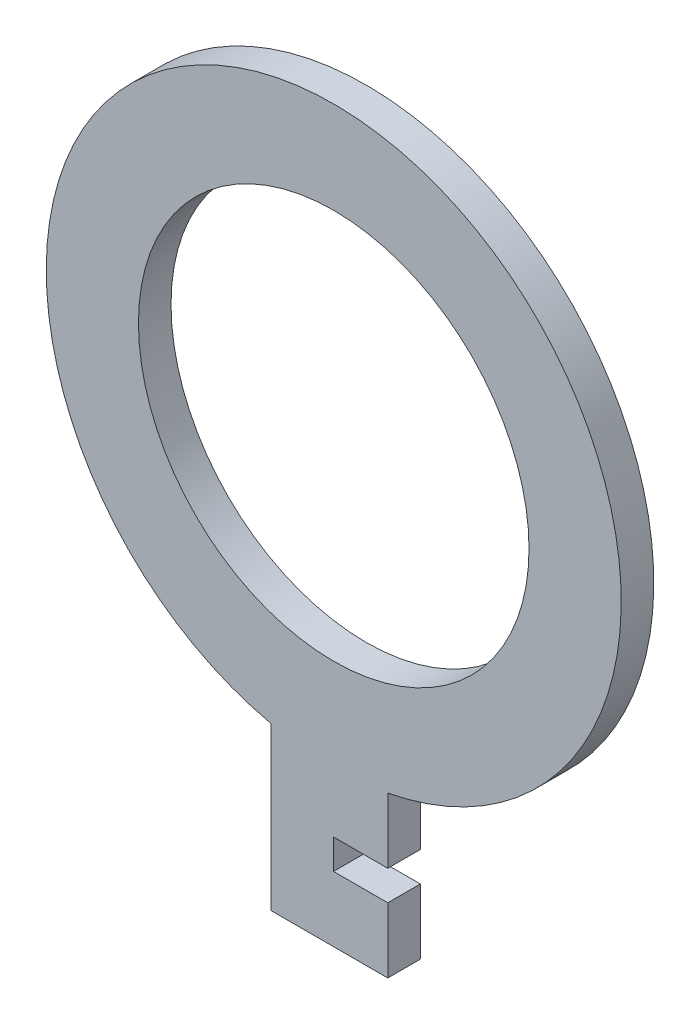
ISO-10303-21;
HEADER;
FILE_DESCRIPTION(('STEP AP214'),'2;1');
FILE_NAME('part.step','',(''),(''),'','','');
FILE_SCHEMA(('AUTOMOTIVE_DESIGN { 1 0 10303 214 1 1 1 1 }'));
ENDSEC;
DATA;
#1=APPLICATION_CONTEXT('core data for automotive mechanical design processes');
#2=APPLICATION_PROTOCOL_DEFINITION('international standard','automotive_design',2000,#1);
#3=PRODUCT_CONTEXT('',#1,'mechanical');
#4=PRODUCT('Part','Part','',(#3));
#5=PRODUCT_RELATED_PRODUCT_CATEGORY('part','',(#4));
#6=PRODUCT_DEFINITION_FORMATION('','',#4);
#7=PRODUCT_DEFINITION_CONTEXT('part definition',#1,'design');
#8=PRODUCT_DEFINITION('design','',#6,#7);
#9=PRODUCT_DEFINITION_SHAPE('','',#8);
#10=(LENGTH_UNIT() NAMED_UNIT(*) SI_UNIT(.MILLI.,.METRE.));
#11=(NAMED_UNIT(*) PLANE_ANGLE_UNIT() SI_UNIT($,.RADIAN.));
#12=(NAMED_UNIT(*) SI_UNIT($,.STERADIAN.) SOLID_ANGLE_UNIT());
#13=UNCERTAINTY_MEASURE_WITH_UNIT(LENGTH_MEASURE(1.E-05),#10,'distance_accuracy_value','');
#14=(GEOMETRIC_REPRESENTATION_CONTEXT(3) GLOBAL_UNCERTAINTY_ASSIGNED_CONTEXT((#13)) GLOBAL_UNIT_ASSIGNED_CONTEXT((#10,
#11,#12)) REPRESENTATION_CONTEXT('',''));
#15=CARTESIAN_POINT('',(0.,0.,0.));
#16=DIRECTION('',(0.,0.,1.));
#17=DIRECTION('',(1.,0.,0.));
#18=AXIS2_PLACEMENT_3D('',#15,#16,#17);
#19=CARTESIAN_POINT('',(69.9384446748844,-1.61765149134436E-13,3.));
#20=DIRECTION('',(-1.,0.,0.));
#21=DIRECTION('',(0.,-1.,0.));
#22=AXIS2_PLACEMENT_3D('',#19,#20,#21);
#23=PLANE('',#22);
#24=DIRECTION('',(0.,1.,0.));
#25=VECTOR('',#24,1.);
#26=CARTESIAN_POINT('',(69.9384446748844,-1.61765149134436E-13,0.));
#27=LINE('',#26,#25);
#28=CARTESIAN_POINT('',(69.9384446748844,26.4211799837218,0.));
#29=VERTEX_POINT('',#28);
#30=CARTESIAN_POINT('',(69.9384446748844,32.4211799837217,0.));
#31=VERTEX_POINT('',#30);
#32=EDGE_CURVE('E153',#29,#31,#27,.T.);
#33=ORIENTED_EDGE('',*,*,#32,.T.);
#34=DIRECTION('',(0.,0.,-1.));
#35=VECTOR('',#34,1.);
#36=CARTESIAN_POINT('',(69.9384446748844,32.4211799837217,3.));
#37=LINE('',#36,#35);
#38=CARTESIAN_POINT('',(69.9384446748844,32.4211799837217,3.));
#39=VERTEX_POINT('',#38);
#40=EDGE_CURVE('E11',#39,#31,#37,.T.);
#41=ORIENTED_EDGE('',*,*,#40,.F.);
#42=DIRECTION('',(0.,1.,0.));
#43=VECTOR('',#42,1.);
#44=CARTESIAN_POINT('',(69.9384446748844,-1.61765149134436E-13,3.));
#45=LINE('',#44,#43);
#46=CARTESIAN_POINT('',(69.9384446748844,26.4211799837218,3.));
#47=VERTEX_POINT('',#46);
#48=EDGE_CURVE('E214',#47,#39,#45,.T.);
#49=ORIENTED_EDGE('',*,*,#48,.F.);
#50=DIRECTION('',(0.,0.,-1.));
#51=VECTOR('',#50,1.);
#52=CARTESIAN_POINT('',(69.9384446748844,26.4211799837218,3.));
#53=LINE('',#52,#51);
#54=EDGE_CURVE('E63',#47,#29,#53,.T.);
#55=ORIENTED_EDGE('',*,*,#54,.T.);
#56=EDGE_LOOP('',(#33,#41,#49,#55));
#57=FACE_BOUND('',#56,.T.);
#58=ADVANCED_FACE('F45',(#57),#23,.F.);
#59=CARTESIAN_POINT('',(64.9620424457152,58.4262025645052,3.));
#60=DIRECTION('',(0.,0.,-1.));
#61=DIRECTION('',(-1.,0.,0.));
#62=AXIS2_PLACEMENT_3D('',#59,#60,#61);
#63=CYLINDRICAL_SURFACE('',#62,26.4768914069144);
#64=CARTESIAN_POINT('',(64.9620424457152,58.4262025645052,0.));
#65=DIRECTION('',(0.,0.,1.));
#66=DIRECTION('',(1.,0.,0.));
#67=AXIS2_PLACEMENT_3D('',#64,#65,#66);
#68=CIRCLE('',#67,26.4768914069144);
#69=CARTESIAN_POINT('',(59.1984010618232,32.5842557227631,0.));
#70=VERTEX_POINT('',#69);
#71=EDGE_CURVE('E156',#31,#70,#68,.T.);
#72=ORIENTED_EDGE('',*,*,#71,.T.);
#73=DIRECTION('',(0.,0.,-1.));
#74=VECTOR('',#73,1.);
#75=CARTESIAN_POINT('',(59.1984010618232,32.5842557227631,3.));
#76=LINE('',#75,#74);
#77=CARTESIAN_POINT('',(59.1984010618232,32.5842557227631,3.));
#78=VERTEX_POINT('',#77);
#79=EDGE_CURVE('E55',#78,#70,#76,.T.);
#80=ORIENTED_EDGE('',*,*,#79,.F.);
#81=CARTESIAN_POINT('',(64.9620424457152,58.4262025645052,3.));
#82=DIRECTION('',(0.,0.,1.));
#83=DIRECTION('',(1.,0.,0.));
#84=AXIS2_PLACEMENT_3D('',#81,#82,#83);
#85=CIRCLE('',#84,26.4768914069144);
#86=EDGE_CURVE('E101',#39,#78,#85,.T.);
#87=ORIENTED_EDGE('',*,*,#86,.F.);
#88=ORIENTED_EDGE('',*,*,#40,.T.);
#89=EDGE_LOOP('',(#72,#80,#87,#88));
#90=FACE_BOUND('',#89,.T.);
#91=ADVANCED_FACE('F199',(#90),#63,.T.);
#92=CARTESIAN_POINT('',(59.1984010618232,0.,3.));
#93=DIRECTION('',(-1.,0.,0.));
#94=DIRECTION('',(0.,-1.,0.));
#95=AXIS2_PLACEMENT_3D('',#92,#93,#94);
#96=PLANE('',#95);
#97=DIRECTION('',(0.,1.,0.));
#98=VECTOR('',#97,1.);
#99=CARTESIAN_POINT('',(59.1984010618232,0.,0.));
#100=LINE('',#99,#98);
#101=CARTESIAN_POINT('',(59.1984010618232,17.6711799837217,0.));
#102=VERTEX_POINT('',#101);
#103=EDGE_CURVE('E160',#102,#70,#100,.T.);
#104=ORIENTED_EDGE('',*,*,#103,.F.);
#105=DIRECTION('',(0.,0.,-1.));
#106=VECTOR('',#105,1.);
#107=CARTESIAN_POINT('',(59.1984010618232,17.6711799837217,3.));
#108=LINE('',#107,#106);
#109=CARTESIAN_POINT('',(59.1984010618232,17.6711799837217,3.));
#110=VERTEX_POINT('',#109);
#111=EDGE_CURVE('E190',#110,#102,#108,.T.);
#112=ORIENTED_EDGE('',*,*,#111,.F.);
#113=DIRECTION('',(0.,1.,0.));
#114=VECTOR('',#113,1.);
#115=CARTESIAN_POINT('',(59.1984010618232,0.,3.));
#116=LINE('',#115,#114);
#117=EDGE_CURVE('E198',#110,#78,#116,.T.);
#118=ORIENTED_EDGE('',*,*,#117,.T.);
#119=ORIENTED_EDGE('',*,*,#79,.T.);
#120=EDGE_LOOP('',(#104,#112,#118,#119));
#121=FACE_BOUND('',#120,.T.);
#122=ADVANCED_FACE('F196',(#121),#96,.T.);
#123=CARTESIAN_POINT('',(0.,17.6711799837217,3.));
#124=DIRECTION('',(0.,-1.,0.));
#125=DIRECTION('',(1.,0.,0.));
#126=AXIS2_PLACEMENT_3D('',#123,#124,#125);
#127=PLANE('',#126);
#128=DIRECTION('',(-1.,0.,0.));
#129=VECTOR('',#128,1.);
#130=CARTESIAN_POINT('',(0.,17.6711799837217,0.));
#131=LINE('',#130,#129);
#132=CARTESIAN_POINT('',(69.9384446748844,17.6711799837218,0.));
#133=VERTEX_POINT('',#132);
#134=EDGE_CURVE('E164',#133,#102,#131,.T.);
#135=ORIENTED_EDGE('',*,*,#134,.F.);
#136=DIRECTION('',(0.,0.,-1.));
#137=VECTOR('',#136,1.);
#138=CARTESIAN_POINT('',(69.9384446748844,17.6711799837218,3.));
#139=LINE('',#138,#137);
#140=CARTESIAN_POINT('',(69.9384446748844,17.6711799837218,3.));
#141=VERTEX_POINT('',#140);
#142=EDGE_CURVE('E187',#141,#133,#139,.T.);
#143=ORIENTED_EDGE('',*,*,#142,.F.);
#144=DIRECTION('',(-1.,0.,0.));
#145=VECTOR('',#144,1.);
#146=CARTESIAN_POINT('',(0.,17.6711799837217,3.));
#147=LINE('',#146,#145);
#148=EDGE_CURVE('E208',#141,#110,#147,.T.);
#149=ORIENTED_EDGE('',*,*,#148,.T.);
#150=ORIENTED_EDGE('',*,*,#111,.T.);
#151=EDGE_LOOP('',(#135,#143,#149,#150));
#152=FACE_BOUND('',#151,.T.);
#153=ADVANCED_FACE('F206',(#152),#127,.T.);
#154=CARTESIAN_POINT('',(69.9384446748844,-1.61765149134436E-13,3.));
#155=DIRECTION('',(-1.,0.,0.));
#156=DIRECTION('',(0.,-1.,0.));
#157=AXIS2_PLACEMENT_3D('',#154,#155,#156);
#158=PLANE('',#157);
#159=DIRECTION('',(0.,1.,0.));
#160=VECTOR('',#159,1.);
#161=CARTESIAN_POINT('',(69.9384446748844,-1.61765149134436E-13,0.));
#162=LINE('',#161,#160);
#163=CARTESIAN_POINT('',(69.9384446748844,23.6711799837218,0.));
#164=VERTEX_POINT('',#163);
#165=EDGE_CURVE('E168',#133,#164,#162,.T.);
#166=ORIENTED_EDGE('',*,*,#165,.T.);
#167=DIRECTION('',(0.,0.,-1.));
#168=VECTOR('',#167,1.);
#169=CARTESIAN_POINT('',(69.9384446748844,23.6711799837218,3.));
#170=LINE('',#169,#168);
#171=CARTESIAN_POINT('',(69.9384446748844,23.6711799837218,3.));
#172=VERTEX_POINT('',#171);
#173=EDGE_CURVE('E139',#172,#164,#170,.T.);
#174=ORIENTED_EDGE('',*,*,#173,.F.);
#175=DIRECTION('',(0.,1.,0.));
#176=VECTOR('',#175,1.);
#177=CARTESIAN_POINT('',(69.9384446748844,-1.61765149134436E-13,3.));
#178=LINE('',#177,#176);
#179=EDGE_CURVE('E125',#141,#172,#178,.T.);
#180=ORIENTED_EDGE('',*,*,#179,.F.);
#181=ORIENTED_EDGE('',*,*,#142,.T.);
#182=EDGE_LOOP('',(#166,#174,#180,#181));
#183=FACE_BOUND('',#182,.T.);
#184=ADVANCED_FACE('F246',(#183),#158,.F.);
#185=CARTESIAN_POINT('',(0.,23.6711799837218,3.));
#186=DIRECTION('',(0.,-1.,0.));
#187=DIRECTION('',(0.,0.,-1.));
#188=AXIS2_PLACEMENT_3D('',#185,#186,#187);
#189=PLANE('',#188);
#190=DIRECTION('',(-1.,0.,0.));
#191=VECTOR('',#190,1.);
#192=CARTESIAN_POINT('',(0.,23.6711799837218,0.));
#193=LINE('',#192,#191);
#194=CARTESIAN_POINT('',(64.9384446748844,23.6711799837218,0.));
#195=VERTEX_POINT('',#194);
#196=EDGE_CURVE('E135',#164,#195,#193,.T.);
#197=ORIENTED_EDGE('',*,*,#196,.T.);
#198=DIRECTION('',(0.,0.,-1.));
#199=VECTOR('',#198,1.);
#200=CARTESIAN_POINT('',(64.9384446748844,23.6711799837218,3.));
#201=LINE('',#200,#199);
#202=CARTESIAN_POINT('',(64.9384446748844,23.6711799837218,3.));
#203=VERTEX_POINT('',#202);
#204=EDGE_CURVE('E132',#203,#195,#201,.T.);
#205=ORIENTED_EDGE('',*,*,#204,.F.);
#206=DIRECTION('',(-1.,0.,0.));
#207=VECTOR('',#206,1.);
#208=CARTESIAN_POINT('',(0.,23.6711799837218,3.));
#209=LINE('',#208,#207);
#210=EDGE_CURVE('E117',#172,#203,#209,.T.);
#211=ORIENTED_EDGE('',*,*,#210,.F.);
#212=ORIENTED_EDGE('',*,*,#173,.T.);
#213=EDGE_LOOP('',(#197,#205,#211,#212));
#214=FACE_BOUND('',#213,.T.);
#215=ADVANCED_FACE('F133',(#214),#189,.F.);
#216=CARTESIAN_POINT('',(64.9384446748846,3.2770980209729E-13,3.));
#217=DIRECTION('',(1.,0.,0.));
#218=DIRECTION('',(0.,1.,0.));
#219=AXIS2_PLACEMENT_3D('',#216,#217,#218);
#220=PLANE('',#219);
#221=DIRECTION('',(0.,-1.,0.));
#222=VECTOR('',#221,1.);
#223=CARTESIAN_POINT('',(64.9384446748846,3.2770980209729E-13,0.));
#224=LINE('',#223,#222);
#225=CARTESIAN_POINT('',(64.9384446748844,26.4211799837217,0.));
#226=VERTEX_POINT('',#225);
#227=EDGE_CURVE('E173',#226,#195,#224,.T.);
#228=ORIENTED_EDGE('',*,*,#227,.F.);
#229=DIRECTION('',(0.,0.,-1.));
#230=VECTOR('',#229,1.);
#231=CARTESIAN_POINT('',(64.9384446748844,26.4211799837217,3.));
#232=LINE('',#231,#230);
#233=CARTESIAN_POINT('',(64.9384446748844,26.4211799837217,3.));
#234=VERTEX_POINT('',#233);
#235=EDGE_CURVE('E89',#234,#226,#232,.T.);
#236=ORIENTED_EDGE('',*,*,#235,.F.);
#237=DIRECTION('',(0.,-1.,0.));
#238=VECTOR('',#237,1.);
#239=CARTESIAN_POINT('',(64.9384446748846,3.2770980209729E-13,3.));
#240=LINE('',#239,#238);
#241=EDGE_CURVE('E122',#234,#203,#240,.T.);
#242=ORIENTED_EDGE('',*,*,#241,.T.);
#243=ORIENTED_EDGE('',*,*,#204,.T.);
#244=EDGE_LOOP('',(#228,#236,#242,#243));
#245=FACE_BOUND('',#244,.T.);
#246=ADVANCED_FACE('F141',(#245),#220,.T.);
#247=CARTESIAN_POINT('',(64.9620424457152,58.4262025645052,3.));
#248=DIRECTION('',(0.,0.,-1.));
#249=DIRECTION('',(-1.,0.,0.));
#250=AXIS2_PLACEMENT_3D('',#247,#248,#249);
#251=CYLINDRICAL_SURFACE('',#250,17.9859510221573);
#252=CARTESIAN_POINT('',(64.9620424457152,58.4262025645052,3.));
#253=DIRECTION('',(0.,0.,1.));
#254=DIRECTION('',(1.,0.,0.));
#255=AXIS2_PLACEMENT_3D('',#252,#253,#254);
#256=CIRCLE('',#255,17.9859510221573);
#257=CARTESIAN_POINT('',(82.9479934678725,58.4262025645052,3.));
#258=VERTEX_POINT('',#257);
#259=EDGE_CURVE('E180',#258,#258,#256,.T.);
#260=ORIENTED_EDGE('',*,*,#259,.T.);
#261=EDGE_LOOP('',(#260));
#262=FACE_BOUND('',#261,.T.);
#263=CARTESIAN_POINT('',(64.9620424457152,58.4262025645052,0.));
#264=DIRECTION('',(0.,0.,1.));
#265=DIRECTION('',(1.,0.,0.));
#266=AXIS2_PLACEMENT_3D('',#263,#264,#265);
#267=CIRCLE('',#266,17.9859510221573);
#268=CARTESIAN_POINT('',(82.9479934678725,58.4262025645052,0.));
#269=VERTEX_POINT('',#268);
#270=EDGE_CURVE('E149',#269,#269,#267,.T.);
#271=ORIENTED_EDGE('',*,*,#270,.F.);
#272=EDGE_LOOP('',(#271));
#273=FACE_BOUND('',#272,.T.);
#274=ADVANCED_FACE('F47',(#262,#273),#251,.F.);
#275=CARTESIAN_POINT('',(0.,26.4211799837217,3.));
#276=DIRECTION('',(0.,-1.,0.));
#277=DIRECTION('',(1.,0.,0.));
#278=AXIS2_PLACEMENT_3D('',#275,#276,#277);
#279=PLANE('',#278);
#280=DIRECTION('',(-1.,0.,0.));
#281=VECTOR('',#280,1.);
#282=CARTESIAN_POINT('',(0.,26.4211799837217,0.));
#283=LINE('',#282,#281);
#284=EDGE_CURVE('E176',#29,#226,#283,.T.);
#285=ORIENTED_EDGE('',*,*,#284,.F.);
#286=ORIENTED_EDGE('',*,*,#54,.F.);
#287=DIRECTION('',(-1.,0.,0.));
#288=VECTOR('',#287,1.);
#289=CARTESIAN_POINT('',(0.,26.4211799837217,3.));
#290=LINE('',#289,#288);
#291=EDGE_CURVE('E143',#47,#234,#290,.T.);
#292=ORIENTED_EDGE('',*,*,#291,.T.);
#293=ORIENTED_EDGE('',*,*,#235,.T.);
#294=EDGE_LOOP('',(#285,#286,#292,#293));
#295=FACE_BOUND('',#294,.T.);
#296=ADVANCED_FACE('F227',(#295),#279,.T.);
#297=CARTESIAN_POINT('',(0.,0.,3.));
#298=DIRECTION('',(0.,0.,1.));
#299=DIRECTION('',(1.,0.,0.));
#300=AXIS2_PLACEMENT_3D('',#297,#298,#299);
#301=PLANE('',#300);
#302=ORIENTED_EDGE('',*,*,#259,.F.);
#303=EDGE_LOOP('',(#302));
#304=FACE_BOUND('',#303,.T.);
#305=ORIENTED_EDGE('',*,*,#48,.T.);
#306=ORIENTED_EDGE('',*,*,#86,.T.);
#307=ORIENTED_EDGE('',*,*,#117,.F.);
#308=ORIENTED_EDGE('',*,*,#148,.F.);
#309=ORIENTED_EDGE('',*,*,#179,.T.);
#310=ORIENTED_EDGE('',*,*,#210,.T.);
#311=ORIENTED_EDGE('',*,*,#241,.F.);
#312=ORIENTED_EDGE('',*,*,#291,.F.);
#313=EDGE_LOOP('',(#305,#306,#307,#308,#309,#310,#311,#312));
#314=FACE_BOUND('',#313,.T.);
#315=ADVANCED_FACE('F119',(#304,#314),#301,.T.);
#316=CARTESIAN_POINT('',(0.,0.,0.));
#317=DIRECTION('',(0.,0.,1.));
#318=DIRECTION('',(1.,0.,0.));
#319=AXIS2_PLACEMENT_3D('',#316,#317,#318);
#320=PLANE('',#319);
#321=ORIENTED_EDGE('',*,*,#270,.T.);
#322=EDGE_LOOP('',(#321));
#323=FACE_BOUND('',#322,.T.);
#324=ORIENTED_EDGE('',*,*,#32,.F.);
#325=ORIENTED_EDGE('',*,*,#284,.T.);
#326=ORIENTED_EDGE('',*,*,#227,.T.);
#327=ORIENTED_EDGE('',*,*,#196,.F.);
#328=ORIENTED_EDGE('',*,*,#165,.F.);
#329=ORIENTED_EDGE('',*,*,#134,.T.);
#330=ORIENTED_EDGE('',*,*,#103,.T.);
#331=ORIENTED_EDGE('',*,*,#71,.F.);
#332=EDGE_LOOP('',(#324,#325,#326,#327,#328,#329,#330,#331));
#333=FACE_BOUND('',#332,.T.);
#334=ADVANCED_FACE('F202',(#323,#333),#320,.F.);
#335=CLOSED_SHELL('',(#58,#91,#122,#153,#184,#215,#246,#274,#296,#315,#334));
#336=MANIFOLD_SOLID_BREP('B2',#335);
#337=ADVANCED_BREP_SHAPE_REPRESENTATION('',(#18,#336),#14);
#338=SHAPE_DEFINITION_REPRESENTATION(#9,#337);
ENDSEC;
END-ISO-10303-21;
